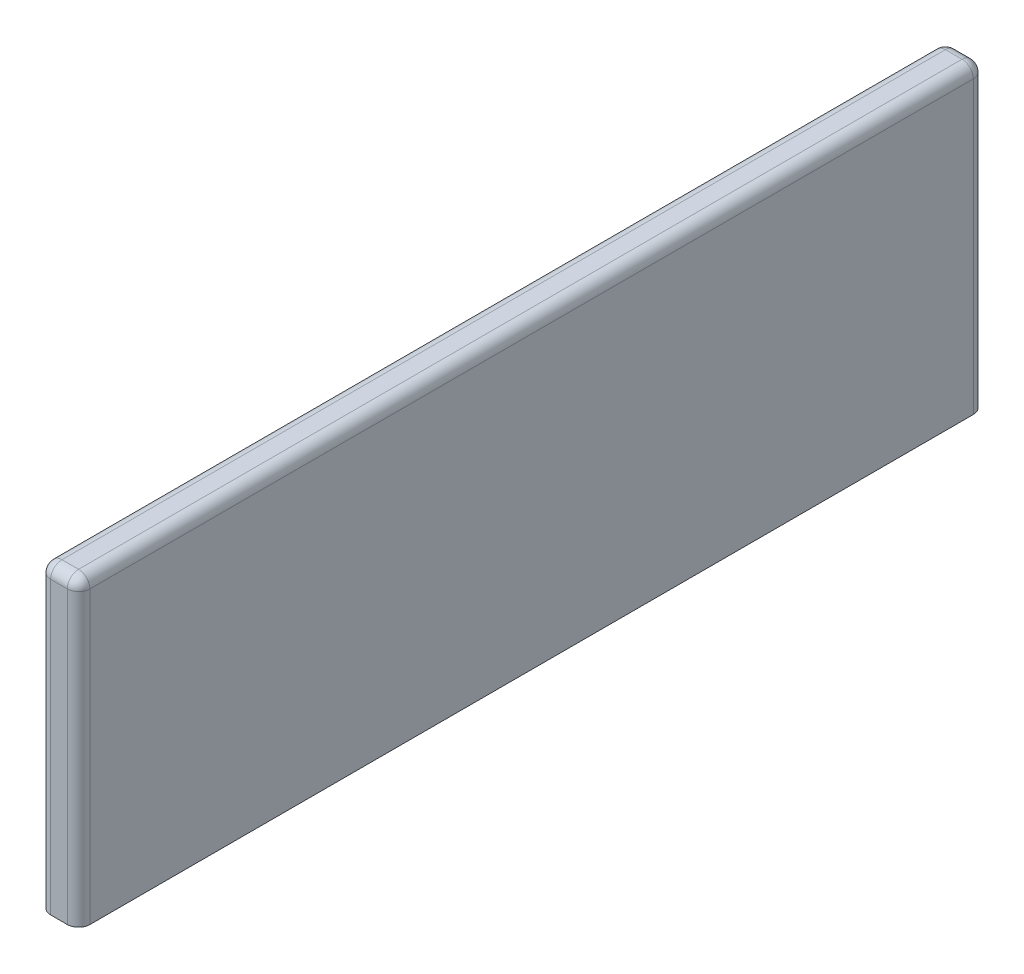
ISO-10303-21;
HEADER;
FILE_DESCRIPTION(('STEP AP214'),'2;1');
FILE_NAME('part.step','',(''),(''),'','','');
FILE_SCHEMA(('AUTOMOTIVE_DESIGN { 1 0 10303 214 1 1 1 1 }'));
ENDSEC;
DATA;
#1=APPLICATION_CONTEXT('core data for automotive mechanical design processes');
#2=APPLICATION_PROTOCOL_DEFINITION('international standard','automotive_design',2000,#1);
#3=PRODUCT_CONTEXT('',#1,'mechanical');
#4=PRODUCT('Part','Part','',(#3));
#5=PRODUCT_RELATED_PRODUCT_CATEGORY('part','',(#4));
#6=PRODUCT_DEFINITION_FORMATION('','',#4);
#7=PRODUCT_DEFINITION_CONTEXT('part definition',#1,'design');
#8=PRODUCT_DEFINITION('design','',#6,#7);
#9=PRODUCT_DEFINITION_SHAPE('','',#8);
#10=(LENGTH_UNIT() NAMED_UNIT(*) SI_UNIT(.MILLI.,.METRE.));
#11=(NAMED_UNIT(*) PLANE_ANGLE_UNIT() SI_UNIT($,.RADIAN.));
#12=(NAMED_UNIT(*) SI_UNIT($,.STERADIAN.) SOLID_ANGLE_UNIT());
#13=UNCERTAINTY_MEASURE_WITH_UNIT(LENGTH_MEASURE(1.E-05),#10,'distance_accuracy_value','');
#14=(GEOMETRIC_REPRESENTATION_CONTEXT(3) GLOBAL_UNCERTAINTY_ASSIGNED_CONTEXT((#13)) GLOBAL_UNIT_ASSIGNED_CONTEXT((#10,
#11,#12)) REPRESENTATION_CONTEXT('',''));
#15=CARTESIAN_POINT('',(0.,0.,0.));
#16=DIRECTION('',(0.,0.,1.));
#17=DIRECTION('',(1.,0.,0.));
#18=AXIS2_PLACEMENT_3D('',#15,#16,#17);
#19=CARTESIAN_POINT('',(0.,0.,60.));
#20=DIRECTION('',(-1.,0.,0.));
#21=DIRECTION('',(0.,-1.,0.));
#22=AXIS2_PLACEMENT_3D('',#19,#20,#21);
#23=PLANE('',#22);
#24=DIRECTION('',(0.,0.,-1.));
#25=VECTOR('',#24,1.);
#26=CARTESIAN_POINT('',(0.,19.25,60.));
#27=LINE('',#26,#25);
#28=CARTESIAN_POINT('',(0.,19.25,0.750000000000001));
#29=VERTEX_POINT('',#28);
#30=CARTESIAN_POINT('',(0.,19.25,59.25));
#31=VERTEX_POINT('',#30);
#32=EDGE_CURVE('E125',#29,#31,#27,.F.);
#33=ORIENTED_EDGE('',*,*,#32,.T.);
#34=DIRECTION('',(0.,1.,0.));
#35=VECTOR('',#34,1.);
#36=CARTESIAN_POINT('',(0.,0.,59.25));
#37=LINE('',#36,#35);
#38=CARTESIAN_POINT('',(0.,0.,59.25));
#39=VERTEX_POINT('',#38);
#40=EDGE_CURVE('E167',#31,#39,#37,.F.);
#41=ORIENTED_EDGE('',*,*,#40,.T.);
#42=DIRECTION('',(0.,0.,-1.));
#43=VECTOR('',#42,1.);
#44=CARTESIAN_POINT('',(0.,0.,60.));
#45=LINE('',#44,#43);
#46=CARTESIAN_POINT('',(0.,0.,0.750000000000001));
#47=VERTEX_POINT('',#46);
#48=EDGE_CURVE('E245',#39,#47,#45,.T.);
#49=ORIENTED_EDGE('',*,*,#48,.T.);
#50=DIRECTION('',(0.,1.,0.));
#51=VECTOR('',#50,1.);
#52=CARTESIAN_POINT('',(0.,0.,0.750000000000001));
#53=LINE('',#52,#51);
#54=EDGE_CURVE('E157',#47,#29,#53,.T.);
#55=ORIENTED_EDGE('',*,*,#54,.T.);
#56=EDGE_LOOP('',(#33,#41,#49,#55));
#57=FACE_BOUND('',#56,.T.);
#58=ADVANCED_FACE('F39',(#57),#23,.F.);
#59=CARTESIAN_POINT('',(0.,20.,60.));
#60=DIRECTION('',(0.,-1.,0.));
#61=DIRECTION('',(0.,0.,-1.));
#62=AXIS2_PLACEMENT_3D('',#59,#60,#61);
#63=PLANE('',#62);
#64=DIRECTION('',(-1.,0.,0.));
#65=VECTOR('',#64,1.);
#66=CARTESIAN_POINT('',(0.,20.,59.25));
#67=LINE('',#66,#65);
#68=CARTESIAN_POINT('',(-1.85,20.,59.25));
#69=VERTEX_POINT('',#68);
#70=CARTESIAN_POINT('',(-0.75,20.,59.25));
#71=VERTEX_POINT('',#70);
#72=EDGE_CURVE('E154',#69,#71,#67,.F.);
#73=ORIENTED_EDGE('',*,*,#72,.T.);
#74=DIRECTION('',(0.,0.,-1.));
#75=VECTOR('',#74,1.);
#76=CARTESIAN_POINT('',(-0.75,20.,60.));
#77=LINE('',#76,#75);
#78=CARTESIAN_POINT('',(-0.75,20.,0.750000000000001));
#79=VERTEX_POINT('',#78);
#80=EDGE_CURVE('E123',#71,#79,#77,.T.);
#81=ORIENTED_EDGE('',*,*,#80,.T.);
#82=DIRECTION('',(-1.,0.,0.));
#83=VECTOR('',#82,1.);
#84=CARTESIAN_POINT('',(0.,20.,0.750000000000001));
#85=LINE('',#84,#83);
#86=CARTESIAN_POINT('',(-1.85,20.,0.750000000000001));
#87=VERTEX_POINT('',#86);
#88=EDGE_CURVE('E142',#79,#87,#85,.T.);
#89=ORIENTED_EDGE('',*,*,#88,.T.);
#90=DIRECTION('',(0.,0.,-1.));
#91=VECTOR('',#90,1.);
#92=CARTESIAN_POINT('',(-1.85,20.,60.));
#93=LINE('',#92,#91);
#94=EDGE_CURVE('E149',#87,#69,#93,.F.);
#95=ORIENTED_EDGE('',*,*,#94,.T.);
#96=EDGE_LOOP('',(#73,#81,#89,#95));
#97=FACE_BOUND('',#96,.T.);
#98=ADVANCED_FACE('F152',(#97),#63,.F.);
#99=CARTESIAN_POINT('',(-2.6,0.,60.));
#100=DIRECTION('',(1.,0.,0.));
#101=DIRECTION('',(0.,0.,-1.));
#102=AXIS2_PLACEMENT_3D('',#99,#100,#101);
#103=PLANE('',#102);
#104=DIRECTION('',(0.,0.,-1.));
#105=VECTOR('',#104,1.);
#106=CARTESIAN_POINT('',(-2.6,0.,60.));
#107=LINE('',#106,#105);
#108=CARTESIAN_POINT('',(-2.6,0.,59.25));
#109=VERTEX_POINT('',#108);
#110=CARTESIAN_POINT('',(-2.6,0.,0.750000000000001));
#111=VERTEX_POINT('',#110);
#112=EDGE_CURVE('E150',#109,#111,#107,.T.);
#113=ORIENTED_EDGE('',*,*,#112,.F.);
#114=DIRECTION('',(0.,-1.,0.));
#115=VECTOR('',#114,1.);
#116=CARTESIAN_POINT('',(-2.6,20.,59.25));
#117=LINE('',#116,#115);
#118=CARTESIAN_POINT('',(-2.6,19.25,59.25));
#119=VERTEX_POINT('',#118);
#120=EDGE_CURVE('E185',#109,#119,#117,.F.);
#121=ORIENTED_EDGE('',*,*,#120,.T.);
#122=DIRECTION('',(0.,0.,-1.));
#123=VECTOR('',#122,1.);
#124=CARTESIAN_POINT('',(-2.6,19.25,60.));
#125=LINE('',#124,#123);
#126=CARTESIAN_POINT('',(-2.6,19.25,0.750000000000001));
#127=VERTEX_POINT('',#126);
#128=EDGE_CURVE('E182',#119,#127,#125,.T.);
#129=ORIENTED_EDGE('',*,*,#128,.T.);
#130=DIRECTION('',(0.,-1.,0.));
#131=VECTOR('',#130,1.);
#132=CARTESIAN_POINT('',(-2.6,0.,0.750000000000001));
#133=LINE('',#132,#131);
#134=EDGE_CURVE('E179',#127,#111,#133,.T.);
#135=ORIENTED_EDGE('',*,*,#134,.T.);
#136=EDGE_LOOP('',(#113,#121,#129,#135));
#137=FACE_BOUND('',#136,.T.);
#138=ADVANCED_FACE('F296',(#137),#103,.F.);
#139=CARTESIAN_POINT('',(0.,0.,60.));
#140=DIRECTION('',(0.,1.,0.));
#141=DIRECTION('',(0.,0.,1.));
#142=AXIS2_PLACEMENT_3D('',#139,#140,#141);
#143=PLANE('',#142);
#144=ORIENTED_EDGE('',*,*,#48,.F.);
#145=CARTESIAN_POINT('',(-0.75,0.,59.25));
#146=DIRECTION('',(0.,1.,0.));
#147=DIRECTION('',(0.,0.,1.));
#148=AXIS2_PLACEMENT_3D('',#145,#146,#147);
#149=CIRCLE('',#148,0.75);
#150=CARTESIAN_POINT('',(-0.75,0.,60.));
#151=VERTEX_POINT('',#150);
#152=EDGE_CURVE('E11',#39,#151,#149,.F.);
#153=ORIENTED_EDGE('',*,*,#152,.T.);
#154=DIRECTION('',(1.,0.,0.));
#155=VECTOR('',#154,1.);
#156=CARTESIAN_POINT('',(0.,0.,60.));
#157=LINE('',#156,#155);
#158=CARTESIAN_POINT('',(-1.85,0.,60.));
#159=VERTEX_POINT('',#158);
#160=EDGE_CURVE('E239',#159,#151,#157,.T.);
#161=ORIENTED_EDGE('',*,*,#160,.F.);
#162=CARTESIAN_POINT('',(-1.85,0.,59.25));
#163=DIRECTION('',(0.,1.,0.));
#164=DIRECTION('',(0.,0.,1.));
#165=AXIS2_PLACEMENT_3D('',#162,#163,#164);
#166=CIRCLE('',#165,0.75);
#167=EDGE_CURVE('E49',#159,#109,#166,.F.);
#168=ORIENTED_EDGE('',*,*,#167,.T.);
#169=ORIENTED_EDGE('',*,*,#112,.T.);
#170=CARTESIAN_POINT('',(-1.85,0.,0.750000000000001));
#171=DIRECTION('',(0.,1.,0.));
#172=DIRECTION('',(0.,0.,1.));
#173=AXIS2_PLACEMENT_3D('',#170,#171,#172);
#174=CIRCLE('',#173,0.75);
#175=CARTESIAN_POINT('',(-1.85,0.,0.));
#176=VERTEX_POINT('',#175);
#177=EDGE_CURVE('E195',#111,#176,#174,.F.);
#178=ORIENTED_EDGE('',*,*,#177,.T.);
#179=DIRECTION('',(1.,0.,0.));
#180=VECTOR('',#179,1.);
#181=CARTESIAN_POINT('',(0.,0.,0.));
#182=LINE('',#181,#180);
#183=CARTESIAN_POINT('',(-0.75,0.,0.));
#184=VERTEX_POINT('',#183);
#185=EDGE_CURVE('E235',#176,#184,#182,.T.);
#186=ORIENTED_EDGE('',*,*,#185,.T.);
#187=CARTESIAN_POINT('',(-0.75,0.,0.750000000000001));
#188=DIRECTION('',(0.,1.,0.));
#189=DIRECTION('',(0.,0.,1.));
#190=AXIS2_PLACEMENT_3D('',#187,#188,#189);
#191=CIRCLE('',#190,0.75);
#192=EDGE_CURVE('E198',#184,#47,#191,.F.);
#193=ORIENTED_EDGE('',*,*,#192,.T.);
#194=EDGE_LOOP('',(#144,#153,#161,#168,#169,#178,#186,#193));
#195=FACE_BOUND('',#194,.T.);
#196=ADVANCED_FACE('F396',(#195),#143,.F.);
#197=CARTESIAN_POINT('',(0.,0.,60.));
#198=DIRECTION('',(0.,0.,1.));
#199=DIRECTION('',(1.,0.,0.));
#200=AXIS2_PLACEMENT_3D('',#197,#198,#199);
#201=PLANE('',#200);
#202=ORIENTED_EDGE('',*,*,#160,.T.);
#203=DIRECTION('',(0.,1.,0.));
#204=VECTOR('',#203,1.);
#205=CARTESIAN_POINT('',(-0.75,20.,60.));
#206=LINE('',#205,#204);
#207=CARTESIAN_POINT('',(-0.75,19.25,60.));
#208=VERTEX_POINT('',#207);
#209=EDGE_CURVE('E176',#151,#208,#206,.T.);
#210=ORIENTED_EDGE('',*,*,#209,.T.);
#211=DIRECTION('',(-1.,0.,0.));
#212=VECTOR('',#211,1.);
#213=CARTESIAN_POINT('',(-2.6,19.25,60.));
#214=LINE('',#213,#212);
#215=CARTESIAN_POINT('',(-1.85,19.25,60.));
#216=VERTEX_POINT('',#215);
#217=EDGE_CURVE('E173',#208,#216,#214,.T.);
#218=ORIENTED_EDGE('',*,*,#217,.T.);
#219=DIRECTION('',(0.,-1.,0.));
#220=VECTOR('',#219,1.);
#221=CARTESIAN_POINT('',(-1.85,0.,60.));
#222=LINE('',#221,#220);
#223=EDGE_CURVE('E170',#216,#159,#222,.T.);
#224=ORIENTED_EDGE('',*,*,#223,.T.);
#225=EDGE_LOOP('',(#202,#210,#218,#224));
#226=FACE_BOUND('',#225,.T.);
#227=ADVANCED_FACE('F388',(#226),#201,.T.);
#228=CARTESIAN_POINT('',(0.,0.,0.));
#229=DIRECTION('',(0.,0.,1.));
#230=DIRECTION('',(1.,0.,0.));
#231=AXIS2_PLACEMENT_3D('',#228,#229,#230);
#232=PLANE('',#231);
#233=DIRECTION('',(-1.,0.,0.));
#234=VECTOR('',#233,1.);
#235=CARTESIAN_POINT('',(0.,19.25,0.));
#236=LINE('',#235,#234);
#237=CARTESIAN_POINT('',(-1.85,19.25,0.));
#238=VERTEX_POINT('',#237);
#239=CARTESIAN_POINT('',(-0.75,19.25,0.));
#240=VERTEX_POINT('',#239);
#241=EDGE_CURVE('E57',#238,#240,#236,.F.);
#242=ORIENTED_EDGE('',*,*,#241,.T.);
#243=DIRECTION('',(0.,1.,0.));
#244=VECTOR('',#243,1.);
#245=CARTESIAN_POINT('',(-0.75,0.,0.));
#246=LINE('',#245,#244);
#247=EDGE_CURVE('E192',#240,#184,#246,.F.);
#248=ORIENTED_EDGE('',*,*,#247,.T.);
#249=ORIENTED_EDGE('',*,*,#185,.F.);
#250=DIRECTION('',(0.,-1.,0.));
#251=VECTOR('',#250,1.);
#252=CARTESIAN_POINT('',(-1.85,0.,0.));
#253=LINE('',#252,#251);
#254=EDGE_CURVE('E62',#176,#238,#253,.F.);
#255=ORIENTED_EDGE('',*,*,#254,.T.);
#256=EDGE_LOOP('',(#242,#248,#249,#255));
#257=FACE_BOUND('',#256,.T.);
#258=ADVANCED_FACE('F276',(#257),#232,.F.);
#259=CARTESIAN_POINT('',(-1.85,0.,59.25));
#260=DIRECTION('',(0.,1.,0.));
#261=DIRECTION('',(0.,0.,1.));
#262=AXIS2_PLACEMENT_3D('',#259,#260,#261);
#263=CYLINDRICAL_SURFACE('',#262,0.75);
#264=ORIENTED_EDGE('',*,*,#167,.F.);
#265=ORIENTED_EDGE('',*,*,#223,.F.);
#266=CARTESIAN_POINT('',(-1.85,19.25,59.25));
#267=DIRECTION('',(0.,1.,0.));
#268=DIRECTION('',(0.,0.,1.));
#269=AXIS2_PLACEMENT_3D('',#266,#267,#268);
#270=CIRCLE('',#269,0.75);
#271=EDGE_CURVE('E43',#119,#216,#270,.T.);
#272=ORIENTED_EDGE('',*,*,#271,.F.);
#273=ORIENTED_EDGE('',*,*,#120,.F.);
#274=EDGE_LOOP('',(#264,#265,#272,#273));
#275=FACE_BOUND('',#274,.T.);
#276=ADVANCED_FACE('F41',(#275),#263,.T.);
#277=CARTESIAN_POINT('',(-1.85,19.25,60.));
#278=DIRECTION('',(0.,0.,-1.));
#279=DIRECTION('',(-1.,0.,0.));
#280=AXIS2_PLACEMENT_3D('',#277,#278,#279);
#281=CYLINDRICAL_SURFACE('',#280,0.75);
#282=CARTESIAN_POINT('',(-1.85,19.25,0.750000000000001));
#283=DIRECTION('',(0.,0.,-1.));
#284=DIRECTION('',(-1.,0.,0.));
#285=AXIS2_PLACEMENT_3D('',#282,#283,#284);
#286=CIRCLE('',#285,0.75);
#287=EDGE_CURVE('E224',#127,#87,#286,.T.);
#288=ORIENTED_EDGE('',*,*,#287,.F.);
#289=ORIENTED_EDGE('',*,*,#128,.F.);
#290=CARTESIAN_POINT('',(-1.85,19.25,59.25));
#291=DIRECTION('',(0.,0.,1.));
#292=DIRECTION('',(1.,0.,0.));
#293=AXIS2_PLACEMENT_3D('',#290,#291,#292);
#294=CIRCLE('',#293,0.75);
#295=EDGE_CURVE('E227',#69,#119,#294,.T.);
#296=ORIENTED_EDGE('',*,*,#295,.F.);
#297=ORIENTED_EDGE('',*,*,#94,.F.);
#298=EDGE_LOOP('',(#288,#289,#296,#297));
#299=FACE_BOUND('',#298,.T.);
#300=ADVANCED_FACE('F257',(#299),#281,.T.);
#301=CARTESIAN_POINT('',(-1.85,0.,0.750000000000001));
#302=DIRECTION('',(0.,-1.,0.));
#303=DIRECTION('',(0.,0.,-1.));
#304=AXIS2_PLACEMENT_3D('',#301,#302,#303);
#305=CYLINDRICAL_SURFACE('',#304,0.75);
#306=ORIENTED_EDGE('',*,*,#177,.F.);
#307=ORIENTED_EDGE('',*,*,#134,.F.);
#308=CARTESIAN_POINT('',(-1.85,19.25,0.75));
#309=DIRECTION('',(0.,1.,0.));
#310=DIRECTION('',(0.,0.,1.));
#311=AXIS2_PLACEMENT_3D('',#308,#309,#310);
#312=CIRCLE('',#311,0.75);
#313=EDGE_CURVE('E220',#238,#127,#312,.T.);
#314=ORIENTED_EDGE('',*,*,#313,.F.);
#315=ORIENTED_EDGE('',*,*,#254,.F.);
#316=EDGE_LOOP('',(#306,#307,#314,#315));
#317=FACE_BOUND('',#316,.T.);
#318=ADVANCED_FACE('F279',(#317),#305,.T.);
#319=CARTESIAN_POINT('',(-1.85,19.25,59.25));
#320=DIRECTION('',(0.,0.,1.));
#321=DIRECTION('',(1.,0.,0.));
#322=AXIS2_PLACEMENT_3D('',#319,#320,#321);
#323=SPHERICAL_SURFACE('',#322,0.75);
#324=ORIENTED_EDGE('',*,*,#295,.T.);
#325=ORIENTED_EDGE('',*,*,#271,.T.);
#326=CARTESIAN_POINT('',(-1.85,19.25,59.25));
#327=DIRECTION('',(-1.,0.,0.));
#328=DIRECTION('',(0.,0.,1.));
#329=AXIS2_PLACEMENT_3D('',#326,#327,#328);
#330=CIRCLE('',#329,0.75);
#331=EDGE_CURVE('E216',#69,#216,#330,.F.);
#332=ORIENTED_EDGE('',*,*,#331,.F.);
#333=EDGE_LOOP('',(#324,#325,#332));
#334=FACE_BOUND('',#333,.T.);
#335=ADVANCED_FACE('F258',(#334),#323,.T.);
#336=CARTESIAN_POINT('',(-1.85,19.25,0.75));
#337=DIRECTION('',(0.,0.,1.));
#338=DIRECTION('',(1.,0.,0.));
#339=AXIS2_PLACEMENT_3D('',#336,#337,#338);
#340=SPHERICAL_SURFACE('',#339,0.75);
#341=ORIENTED_EDGE('',*,*,#313,.T.);
#342=ORIENTED_EDGE('',*,*,#287,.T.);
#343=CARTESIAN_POINT('',(-1.85,19.25,0.750000000000001));
#344=DIRECTION('',(-1.,0.,0.));
#345=DIRECTION('',(0.,0.,1.));
#346=AXIS2_PLACEMENT_3D('',#343,#344,#345);
#347=CIRCLE('',#346,0.75);
#348=EDGE_CURVE('E145',#238,#87,#347,.F.);
#349=ORIENTED_EDGE('',*,*,#348,.F.);
#350=EDGE_LOOP('',(#341,#342,#349));
#351=FACE_BOUND('',#350,.T.);
#352=ADVANCED_FACE('F282',(#351),#340,.T.);
#353=CARTESIAN_POINT('',(-0.75,0.,59.25));
#354=DIRECTION('',(0.,-1.,0.));
#355=DIRECTION('',(1.,0.,0.));
#356=AXIS2_PLACEMENT_3D('',#353,#354,#355);
#357=CYLINDRICAL_SURFACE('',#356,0.75);
#358=ORIENTED_EDGE('',*,*,#152,.F.);
#359=ORIENTED_EDGE('',*,*,#40,.F.);
#360=CARTESIAN_POINT('',(-0.75,19.25,59.25));
#361=DIRECTION('',(0.,1.,0.));
#362=DIRECTION('',(0.,0.,1.));
#363=AXIS2_PLACEMENT_3D('',#360,#361,#362);
#364=CIRCLE('',#363,0.75);
#365=EDGE_CURVE('E210',#208,#31,#364,.T.);
#366=ORIENTED_EDGE('',*,*,#365,.F.);
#367=ORIENTED_EDGE('',*,*,#209,.F.);
#368=EDGE_LOOP('',(#358,#359,#366,#367));
#369=FACE_BOUND('',#368,.T.);
#370=ADVANCED_FACE('F270',(#369),#357,.T.);
#371=CARTESIAN_POINT('',(0.,19.25,59.25));
#372=DIRECTION('',(1.,0.,0.));
#373=DIRECTION('',(0.,0.,-1.));
#374=AXIS2_PLACEMENT_3D('',#371,#372,#373);
#375=CYLINDRICAL_SURFACE('',#374,0.75);
#376=ORIENTED_EDGE('',*,*,#331,.T.);
#377=ORIENTED_EDGE('',*,*,#217,.F.);
#378=CARTESIAN_POINT('',(-0.75,19.25,59.25));
#379=DIRECTION('',(1.,0.,0.));
#380=DIRECTION('',(0.,0.,-1.));
#381=AXIS2_PLACEMENT_3D('',#378,#379,#380);
#382=CIRCLE('',#381,0.75);
#383=EDGE_CURVE('E139',#71,#208,#382,.T.);
#384=ORIENTED_EDGE('',*,*,#383,.F.);
#385=ORIENTED_EDGE('',*,*,#72,.F.);
#386=EDGE_LOOP('',(#376,#377,#384,#385));
#387=FACE_BOUND('',#386,.T.);
#388=ADVANCED_FACE('F261',(#387),#375,.T.);
#389=CARTESIAN_POINT('',(0.,19.25,0.750000000000001));
#390=DIRECTION('',(-1.,0.,0.));
#391=DIRECTION('',(0.,0.,1.));
#392=AXIS2_PLACEMENT_3D('',#389,#390,#391);
#393=CYLINDRICAL_SURFACE('',#392,0.75);
#394=ORIENTED_EDGE('',*,*,#348,.T.);
#395=ORIENTED_EDGE('',*,*,#88,.F.);
#396=CARTESIAN_POINT('',(-0.75,19.25,0.75));
#397=DIRECTION('',(1.,0.,0.));
#398=DIRECTION('',(0.,0.,-1.));
#399=AXIS2_PLACEMENT_3D('',#396,#397,#398);
#400=CIRCLE('',#399,0.75);
#401=EDGE_CURVE('E132',#240,#79,#400,.T.);
#402=ORIENTED_EDGE('',*,*,#401,.F.);
#403=ORIENTED_EDGE('',*,*,#241,.F.);
#404=EDGE_LOOP('',(#394,#395,#402,#403));
#405=FACE_BOUND('',#404,.T.);
#406=ADVANCED_FACE('F143',(#405),#393,.T.);
#407=CARTESIAN_POINT('',(-0.75,0.,0.750000000000001));
#408=DIRECTION('',(0.,1.,0.));
#409=DIRECTION('',(-1.,0.,0.));
#410=AXIS2_PLACEMENT_3D('',#407,#408,#409);
#411=CYLINDRICAL_SURFACE('',#410,0.75);
#412=ORIENTED_EDGE('',*,*,#192,.F.);
#413=ORIENTED_EDGE('',*,*,#247,.F.);
#414=CARTESIAN_POINT('',(-0.75,19.25,0.750000000000001));
#415=DIRECTION('',(0.,1.,0.));
#416=DIRECTION('',(0.,0.,1.));
#417=AXIS2_PLACEMENT_3D('',#414,#415,#416);
#418=CIRCLE('',#417,0.75);
#419=EDGE_CURVE('E136',#29,#240,#418,.T.);
#420=ORIENTED_EDGE('',*,*,#419,.F.);
#421=ORIENTED_EDGE('',*,*,#54,.F.);
#422=EDGE_LOOP('',(#412,#413,#420,#421));
#423=FACE_BOUND('',#422,.T.);
#424=ADVANCED_FACE('F275',(#423),#411,.T.);
#425=CARTESIAN_POINT('',(-0.75,19.25,59.25));
#426=DIRECTION('',(0.,0.,1.));
#427=DIRECTION('',(1.,0.,0.));
#428=AXIS2_PLACEMENT_3D('',#425,#426,#427);
#429=SPHERICAL_SURFACE('',#428,0.75);
#430=ORIENTED_EDGE('',*,*,#383,.T.);
#431=ORIENTED_EDGE('',*,*,#365,.T.);
#432=CARTESIAN_POINT('',(-0.75,19.25,59.25));
#433=DIRECTION('',(0.,0.,1.));
#434=DIRECTION('',(1.,0.,0.));
#435=AXIS2_PLACEMENT_3D('',#432,#433,#434);
#436=CIRCLE('',#435,0.75);
#437=EDGE_CURVE('E129',#71,#31,#436,.F.);
#438=ORIENTED_EDGE('',*,*,#437,.F.);
#439=EDGE_LOOP('',(#430,#431,#438));
#440=FACE_BOUND('',#439,.T.);
#441=ADVANCED_FACE('F265',(#440),#429,.T.);
#442=CARTESIAN_POINT('',(-0.75,19.25,0.75));
#443=DIRECTION('',(0.,0.,1.));
#444=DIRECTION('',(1.,0.,0.));
#445=AXIS2_PLACEMENT_3D('',#442,#443,#444);
#446=SPHERICAL_SURFACE('',#445,0.75);
#447=ORIENTED_EDGE('',*,*,#419,.T.);
#448=ORIENTED_EDGE('',*,*,#401,.T.);
#449=CARTESIAN_POINT('',(-0.75,19.25,0.750000000000001));
#450=DIRECTION('',(0.,0.,-1.));
#451=DIRECTION('',(-1.,0.,0.));
#452=AXIS2_PLACEMENT_3D('',#449,#450,#451);
#453=CIRCLE('',#452,0.75);
#454=EDGE_CURVE('E119',#29,#79,#453,.F.);
#455=ORIENTED_EDGE('',*,*,#454,.F.);
#456=EDGE_LOOP('',(#447,#448,#455));
#457=FACE_BOUND('',#456,.T.);
#458=ADVANCED_FACE('F134',(#457),#446,.T.);
#459=CARTESIAN_POINT('',(-0.75,19.25,60.));
#460=DIRECTION('',(0.,0.,-1.));
#461=DIRECTION('',(-1.,0.,0.));
#462=AXIS2_PLACEMENT_3D('',#459,#460,#461);
#463=CYLINDRICAL_SURFACE('',#462,0.75);
#464=ORIENTED_EDGE('',*,*,#437,.T.);
#465=ORIENTED_EDGE('',*,*,#32,.F.);
#466=ORIENTED_EDGE('',*,*,#454,.T.);
#467=ORIENTED_EDGE('',*,*,#80,.F.);
#468=EDGE_LOOP('',(#464,#465,#466,#467));
#469=FACE_BOUND('',#468,.T.);
#470=ADVANCED_FACE('F121',(#469),#463,.T.);
#471=CLOSED_SHELL('',(#58,#98,#138,#196,#227,#258,#276,#300,#318,#335,#352,#370,#388,#406,#424,
#441,#458,#470));
#472=MANIFOLD_SOLID_BREP('B2',#471);
#473=ADVANCED_BREP_SHAPE_REPRESENTATION('',(#18,#472),#14);
#474=SHAPE_DEFINITION_REPRESENTATION(#9,#473);
ENDSEC;
END-ISO-10303-21;
